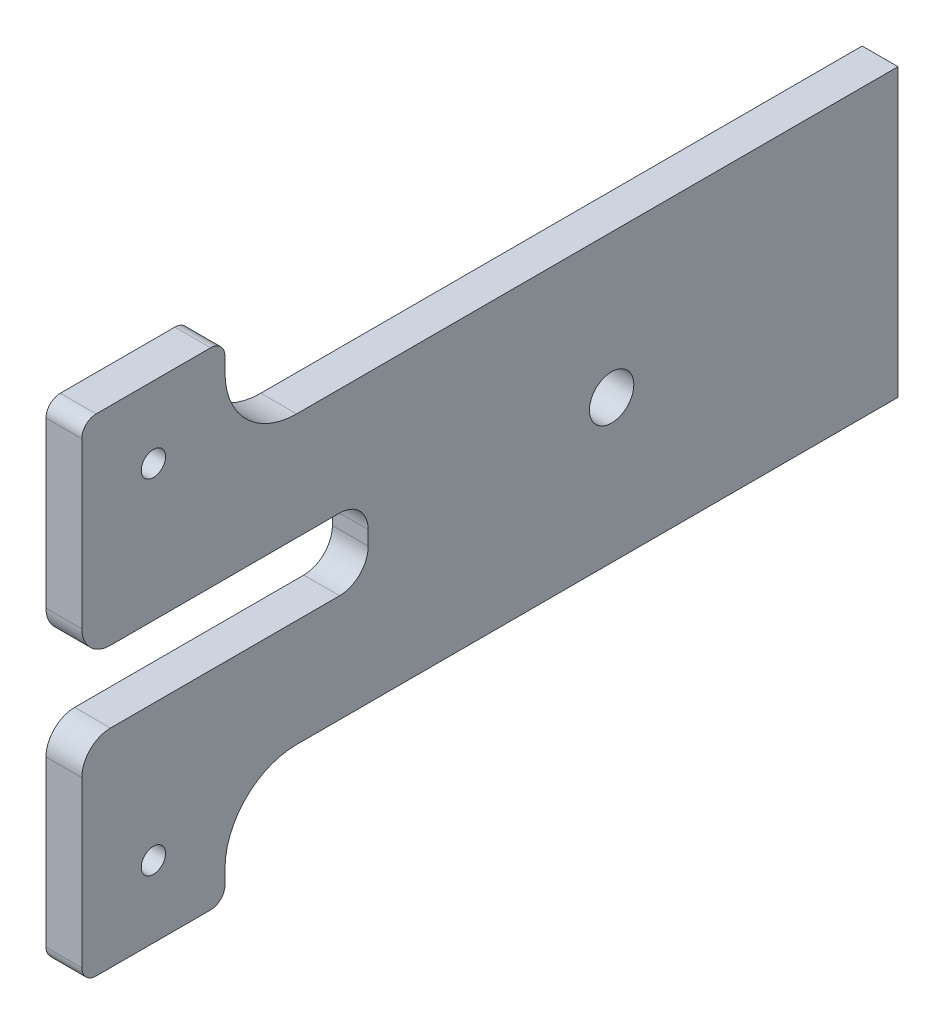
ISO-10303-21;
HEADER;
FILE_DESCRIPTION(('STEP AP214'),'2;1');
FILE_NAME('part.step','',(''),(''),'','','');
FILE_SCHEMA(('AUTOMOTIVE_DESIGN { 1 0 10303 214 1 1 1 1 }'));
ENDSEC;
DATA;
#1=APPLICATION_CONTEXT('core data for automotive mechanical design processes');
#2=APPLICATION_PROTOCOL_DEFINITION('international standard','automotive_design',2000,#1);
#3=PRODUCT_CONTEXT('',#1,'mechanical');
#4=PRODUCT('Part','Part','',(#3));
#5=PRODUCT_RELATED_PRODUCT_CATEGORY('part','',(#4));
#6=PRODUCT_DEFINITION_FORMATION('','',#4);
#7=PRODUCT_DEFINITION_CONTEXT('part definition',#1,'design');
#8=PRODUCT_DEFINITION('design','',#6,#7);
#9=PRODUCT_DEFINITION_SHAPE('','',#8);
#10=(LENGTH_UNIT() NAMED_UNIT(*) SI_UNIT(.MILLI.,.METRE.));
#11=(NAMED_UNIT(*) PLANE_ANGLE_UNIT() SI_UNIT($,.RADIAN.));
#12=(NAMED_UNIT(*) SI_UNIT($,.STERADIAN.) SOLID_ANGLE_UNIT());
#13=UNCERTAINTY_MEASURE_WITH_UNIT(LENGTH_MEASURE(1.E-05),#10,'distance_accuracy_value','');
#14=(GEOMETRIC_REPRESENTATION_CONTEXT(3) GLOBAL_UNCERTAINTY_ASSIGNED_CONTEXT((#13)) GLOBAL_UNIT_ASSIGNED_CONTEXT((#10,
#11,#12)) REPRESENTATION_CONTEXT('',''));
#15=CARTESIAN_POINT('',(0.,0.,0.));
#16=DIRECTION('',(0.,0.,1.));
#17=DIRECTION('',(1.,0.,0.));
#18=AXIS2_PLACEMENT_3D('',#15,#16,#17);
#19=CARTESIAN_POINT('',(5.,-34.,114.));
#20=DIRECTION('',(0.,0.,-1.));
#21=DIRECTION('',(0.,1.,0.));
#22=AXIS2_PLACEMENT_3D('',#19,#20,#21);
#23=PLANE('',#22);
#24=DIRECTION('',(0.,-1.,0.));
#25=VECTOR('',#24,1.);
#26=CARTESIAN_POINT('',(0.,-34.,114.));
#27=LINE('',#26,#25);
#28=CARTESIAN_POINT('',(0.,32.,114.));
#29=VERTEX_POINT('',#28);
#30=CARTESIAN_POINT('',(0.,9.,114.));
#31=VERTEX_POINT('',#30);
#32=EDGE_CURVE('E456',#29,#31,#27,.T.);
#33=ORIENTED_EDGE('',*,*,#32,.T.);
#34=DIRECTION('',(-1.,0.,0.));
#35=VECTOR('',#34,1.);
#36=CARTESIAN_POINT('',(5.,9.,114.));
#37=LINE('',#36,#35);
#38=CARTESIAN_POINT('',(5.,9.,114.));
#39=VERTEX_POINT('',#38);
#40=EDGE_CURVE('E61',#31,#39,#37,.F.);
#41=ORIENTED_EDGE('',*,*,#40,.T.);
#42=DIRECTION('',(0.,-1.,0.));
#43=VECTOR('',#42,1.);
#44=CARTESIAN_POINT('',(5.,-34.,114.));
#45=LINE('',#44,#43);
#46=CARTESIAN_POINT('',(5.,32.,114.));
#47=VERTEX_POINT('',#46);
#48=EDGE_CURVE('E430',#47,#39,#45,.T.);
#49=ORIENTED_EDGE('',*,*,#48,.F.);
#50=DIRECTION('',(-1.,0.,0.));
#51=VECTOR('',#50,1.);
#52=CARTESIAN_POINT('',(5.,32.,114.));
#53=LINE('',#52,#51);
#54=EDGE_CURVE('E266',#47,#29,#53,.T.);
#55=ORIENTED_EDGE('',*,*,#54,.T.);
#56=EDGE_LOOP('',(#33,#41,#49,#55));
#57=FACE_BOUND('',#56,.T.);
#58=ADVANCED_FACE('F45',(#57),#23,.F.);
#59=CARTESIAN_POINT('',(5.,0.,0.));
#60=DIRECTION('',(1.,0.,0.));
#61=DIRECTION('',(0.,0.,-1.));
#62=AXIS2_PLACEMENT_3D('',#59,#60,#61);
#63=PLANE('',#62);
#64=DIRECTION('',(0.,0.,1.));
#65=VECTOR('',#64,1.);
#66=CARTESIAN_POINT('',(5.,-5.,114.));
#67=LINE('',#66,#65);
#68=CARTESIAN_POINT('',(5.,-5.,78.));
#69=VERTEX_POINT('',#68);
#70=CARTESIAN_POINT('',(5.,-5.,110.));
#71=VERTEX_POINT('',#70);
#72=EDGE_CURVE('E385',#69,#71,#67,.T.);
#73=ORIENTED_EDGE('',*,*,#72,.T.);
#74=CARTESIAN_POINT('',(5.,-9.,110.));
#75=DIRECTION('',(1.,0.,0.));
#76=DIRECTION('',(0.,0.,-1.));
#77=AXIS2_PLACEMENT_3D('',#74,#75,#76);
#78=CIRCLE('',#77,4.);
#79=CARTESIAN_POINT('',(5.,-9.,114.));
#80=VERTEX_POINT('',#79);
#81=EDGE_CURVE('E336',#71,#80,#78,.T.);
#82=ORIENTED_EDGE('',*,*,#81,.T.);
#83=CARTESIAN_POINT('',(5.,-32.,114.));
#84=VERTEX_POINT('',#83);
#85=EDGE_CURVE('E429',#80,#84,#45,.T.);
#86=ORIENTED_EDGE('',*,*,#85,.T.);
#87=CARTESIAN_POINT('',(5.,-32.,112.));
#88=DIRECTION('',(1.,0.,0.));
#89=DIRECTION('',(0.,0.,-1.));
#90=AXIS2_PLACEMENT_3D('',#87,#88,#89);
#91=CIRCLE('',#90,2.);
#92=CARTESIAN_POINT('',(5.,-34.,112.));
#93=VERTEX_POINT('',#92);
#94=EDGE_CURVE('E293',#84,#93,#91,.T.);
#95=ORIENTED_EDGE('',*,*,#94,.T.);
#96=DIRECTION('',(0.,0.,-1.));
#97=VECTOR('',#96,1.);
#98=CARTESIAN_POINT('',(5.,-34.,114.));
#99=LINE('',#98,#97);
#100=CARTESIAN_POINT('',(5.,-34.,96.));
#101=VERTEX_POINT('',#100);
#102=EDGE_CURVE('E433',#93,#101,#99,.T.);
#103=ORIENTED_EDGE('',*,*,#102,.T.);
#104=CARTESIAN_POINT('',(5.,-32.,96.));
#105=DIRECTION('',(1.,0.,0.));
#106=DIRECTION('',(0.,0.,-1.));
#107=AXIS2_PLACEMENT_3D('',#104,#105,#106);
#108=CIRCLE('',#107,2.);
#109=CARTESIAN_POINT('',(5.,-32.,94.));
#110=VERTEX_POINT('',#109);
#111=EDGE_CURVE('E290',#101,#110,#108,.T.);
#112=ORIENTED_EDGE('',*,*,#111,.T.);
#113=DIRECTION('',(0.,1.,0.));
#114=VECTOR('',#113,1.);
#115=CARTESIAN_POINT('',(5.,-34.,94.));
#116=LINE('',#115,#114);
#117=CARTESIAN_POINT('',(5.,-30.,94.));
#118=VERTEX_POINT('',#117);
#119=EDGE_CURVE('E437',#110,#118,#116,.T.);
#120=ORIENTED_EDGE('',*,*,#119,.T.);
#121=CARTESIAN_POINT('',(5.,-30.,84.));
#122=DIRECTION('',(1.,0.,0.));
#123=DIRECTION('',(0.,0.,-1.));
#124=AXIS2_PLACEMENT_3D('',#121,#122,#123);
#125=CIRCLE('',#124,10.);
#126=CARTESIAN_POINT('',(5.,-20.,84.));
#127=VERTEX_POINT('',#126);
#128=EDGE_CURVE('E253',#118,#127,#125,.F.);
#129=ORIENTED_EDGE('',*,*,#128,.T.);
#130=DIRECTION('',(0.,0.,-1.));
#131=VECTOR('',#130,1.);
#132=CARTESIAN_POINT('',(5.,-20.,0.));
#133=LINE('',#132,#131);
#134=CARTESIAN_POINT('',(5.,-20.,0.));
#135=VERTEX_POINT('',#134);
#136=EDGE_CURVE('E218',#127,#135,#133,.T.);
#137=ORIENTED_EDGE('',*,*,#136,.T.);
#138=DIRECTION('',(0.,1.,0.));
#139=VECTOR('',#138,1.);
#140=CARTESIAN_POINT('',(5.,-20.,0.));
#141=LINE('',#140,#139);
#142=CARTESIAN_POINT('',(5.,20.,0.));
#143=VERTEX_POINT('',#142);
#144=EDGE_CURVE('E211',#135,#143,#141,.T.);
#145=ORIENTED_EDGE('',*,*,#144,.T.);
#146=DIRECTION('',(0.,0.,1.));
#147=VECTOR('',#146,1.);
#148=CARTESIAN_POINT('',(5.,20.,0.));
#149=LINE('',#148,#147);
#150=CARTESIAN_POINT('',(5.,20.,84.));
#151=VERTEX_POINT('',#150);
#152=EDGE_CURVE('E198',#143,#151,#149,.T.);
#153=ORIENTED_EDGE('',*,*,#152,.T.);
#154=CARTESIAN_POINT('',(5.,30.,84.));
#155=DIRECTION('',(1.,0.,0.));
#156=DIRECTION('',(0.,0.,-1.));
#157=AXIS2_PLACEMENT_3D('',#154,#155,#156);
#158=CIRCLE('',#157,10.);
#159=CARTESIAN_POINT('',(5.,30.,94.));
#160=VERTEX_POINT('',#159);
#161=EDGE_CURVE('E259',#151,#160,#158,.F.);
#162=ORIENTED_EDGE('',*,*,#161,.T.);
#163=DIRECTION('',(0.,1.,0.));
#164=VECTOR('',#163,1.);
#165=CARTESIAN_POINT('',(5.,20.,94.));
#166=LINE('',#165,#164);
#167=CARTESIAN_POINT('',(5.,32.,94.));
#168=VERTEX_POINT('',#167);
#169=EDGE_CURVE('E210',#160,#168,#166,.T.);
#170=ORIENTED_EDGE('',*,*,#169,.T.);
#171=CARTESIAN_POINT('',(5.,32.,96.));
#172=DIRECTION('',(1.,0.,0.));
#173=DIRECTION('',(0.,0.,-1.));
#174=AXIS2_PLACEMENT_3D('',#171,#172,#173);
#175=CIRCLE('',#174,2.);
#176=CARTESIAN_POINT('',(5.,34.,96.));
#177=VERTEX_POINT('',#176);
#178=EDGE_CURVE('E296',#168,#177,#175,.T.);
#179=ORIENTED_EDGE('',*,*,#178,.T.);
#180=DIRECTION('',(0.,0.,1.));
#181=VECTOR('',#180,1.);
#182=CARTESIAN_POINT('',(5.,34.,94.));
#183=LINE('',#182,#181);
#184=CARTESIAN_POINT('',(5.,34.,112.));
#185=VERTEX_POINT('',#184);
#186=EDGE_CURVE('E425',#177,#185,#183,.T.);
#187=ORIENTED_EDGE('',*,*,#186,.T.);
#188=CARTESIAN_POINT('',(5.,32.,112.));
#189=DIRECTION('',(1.,0.,0.));
#190=DIRECTION('',(0.,0.,-1.));
#191=AXIS2_PLACEMENT_3D('',#188,#189,#190);
#192=CIRCLE('',#191,2.);
#193=EDGE_CURVE('E299',#185,#47,#192,.T.);
#194=ORIENTED_EDGE('',*,*,#193,.T.);
#195=ORIENTED_EDGE('',*,*,#48,.T.);
#196=CARTESIAN_POINT('',(5.,9.,110.));
#197=DIRECTION('',(1.,0.,0.));
#198=DIRECTION('',(0.,0.,-1.));
#199=AXIS2_PLACEMENT_3D('',#196,#197,#198);
#200=CIRCLE('',#199,4.);
#201=CARTESIAN_POINT('',(5.,5.,110.));
#202=VERTEX_POINT('',#201);
#203=EDGE_CURVE('E333',#39,#202,#200,.T.);
#204=ORIENTED_EDGE('',*,*,#203,.T.);
#205=DIRECTION('',(0.,0.,-1.));
#206=VECTOR('',#205,1.);
#207=CARTESIAN_POINT('',(5.,5.,114.));
#208=LINE('',#207,#206);
#209=CARTESIAN_POINT('',(5.,4.99999999999999,78.));
#210=VERTEX_POINT('',#209);
#211=EDGE_CURVE('E382',#202,#210,#208,.T.);
#212=ORIENTED_EDGE('',*,*,#211,.T.);
#213=CARTESIAN_POINT('',(5.,0.999999999999988,78.));
#214=DIRECTION('',(1.,0.,0.));
#215=DIRECTION('',(0.,0.,-1.));
#216=AXIS2_PLACEMENT_3D('',#213,#214,#215);
#217=CIRCLE('',#216,4.);
#218=CARTESIAN_POINT('',(5.,0.999999999999988,74.));
#219=VERTEX_POINT('',#218);
#220=EDGE_CURVE('E11',#210,#219,#217,.F.);
#221=ORIENTED_EDGE('',*,*,#220,.T.);
#222=DIRECTION('',(0.,-1.,0.));
#223=VECTOR('',#222,1.);
#224=CARTESIAN_POINT('',(5.,4.99999999999999,74.));
#225=LINE('',#224,#223);
#226=CARTESIAN_POINT('',(5.,-1.00000000000001,74.));
#227=VERTEX_POINT('',#226);
#228=EDGE_CURVE('E380',#219,#227,#225,.T.);
#229=ORIENTED_EDGE('',*,*,#228,.T.);
#230=CARTESIAN_POINT('',(5.,-1.,78.));
#231=DIRECTION('',(1.,0.,0.));
#232=DIRECTION('',(0.,0.,-1.));
#233=AXIS2_PLACEMENT_3D('',#230,#231,#232);
#234=CIRCLE('',#233,4.);
#235=EDGE_CURVE('E357',#227,#69,#234,.F.);
#236=ORIENTED_EDGE('',*,*,#235,.T.);
#237=EDGE_LOOP('',(#73,#82,#86,#95,#103,#112,#120,#129,#137,#145,#153,#162,#170,#179,#187,#194,
#195,#204,#212,#221,#229,#236));
#238=FACE_BOUND('',#237,.T.);
#239=CARTESIAN_POINT('',(5.,-24.,104.));
#240=DIRECTION('',(1.,0.,0.));
#241=DIRECTION('',(0.,0.,-1.));
#242=AXIS2_PLACEMENT_3D('',#239,#240,#241);
#243=CIRCLE('',#242,1.7);
#244=CARTESIAN_POINT('',(5.,-24.,102.3));
#245=VERTEX_POINT('',#244);
#246=EDGE_CURVE('E407',#245,#245,#243,.T.);
#247=ORIENTED_EDGE('',*,*,#246,.F.);
#248=EDGE_LOOP('',(#247));
#249=FACE_BOUND('',#248,.T.);
#250=CARTESIAN_POINT('',(5.,0.,40.));
#251=DIRECTION('',(1.,0.,0.));
#252=DIRECTION('',(0.,0.,-1.));
#253=AXIS2_PLACEMENT_3D('',#250,#251,#252);
#254=CIRCLE('',#253,3.1);
#255=CARTESIAN_POINT('',(5.,0.,36.9));
#256=VERTEX_POINT('',#255);
#257=EDGE_CURVE('E415',#256,#256,#254,.T.);
#258=ORIENTED_EDGE('',*,*,#257,.F.);
#259=EDGE_LOOP('',(#258));
#260=FACE_BOUND('',#259,.T.);
#261=CARTESIAN_POINT('',(5.,24.,104.));
#262=DIRECTION('',(1.,0.,0.));
#263=DIRECTION('',(0.,0.,-1.));
#264=AXIS2_PLACEMENT_3D('',#261,#262,#263);
#265=CIRCLE('',#264,1.7);
#266=CARTESIAN_POINT('',(5.,24.,102.3));
#267=VERTEX_POINT('',#266);
#268=EDGE_CURVE('E399',#267,#267,#265,.T.);
#269=ORIENTED_EDGE('',*,*,#268,.F.);
#270=EDGE_LOOP('',(#269));
#271=FACE_BOUND('',#270,.T.);
#272=ADVANCED_FACE('F215',(#238,#249,#260,#271),#63,.T.);
#273=CARTESIAN_POINT('',(0.,0.,0.));
#274=DIRECTION('',(1.,0.,0.));
#275=DIRECTION('',(0.,0.,-1.));
#276=AXIS2_PLACEMENT_3D('',#273,#274,#275);
#277=PLANE('',#276);
#278=CARTESIAN_POINT('',(0.,-9.,114.));
#279=VERTEX_POINT('',#278);
#280=CARTESIAN_POINT('',(0.,-32.,114.));
#281=VERTEX_POINT('',#280);
#282=EDGE_CURVE('E455',#279,#281,#27,.T.);
#283=ORIENTED_EDGE('',*,*,#282,.F.);
#284=CARTESIAN_POINT('',(0.,-9.,110.));
#285=DIRECTION('',(1.,0.,0.));
#286=DIRECTION('',(0.,0.,-1.));
#287=AXIS2_PLACEMENT_3D('',#284,#285,#286);
#288=CIRCLE('',#287,4.);
#289=CARTESIAN_POINT('',(0.,-5.,110.));
#290=VERTEX_POINT('',#289);
#291=EDGE_CURVE('E323',#279,#290,#288,.F.);
#292=ORIENTED_EDGE('',*,*,#291,.T.);
#293=DIRECTION('',(0.,0.,1.));
#294=VECTOR('',#293,1.);
#295=CARTESIAN_POINT('',(0.,-5.,114.));
#296=LINE('',#295,#294);
#297=CARTESIAN_POINT('',(0.,-5.,78.));
#298=VERTEX_POINT('',#297);
#299=EDGE_CURVE('E391',#298,#290,#296,.T.);
#300=ORIENTED_EDGE('',*,*,#299,.F.);
#301=CARTESIAN_POINT('',(0.,-1.,78.));
#302=DIRECTION('',(1.,0.,0.));
#303=DIRECTION('',(0.,0.,-1.));
#304=AXIS2_PLACEMENT_3D('',#301,#302,#303);
#305=CIRCLE('',#304,4.);
#306=CARTESIAN_POINT('',(0.,-1.00000000000001,74.));
#307=VERTEX_POINT('',#306);
#308=EDGE_CURVE('E354',#298,#307,#305,.T.);
#309=ORIENTED_EDGE('',*,*,#308,.T.);
#310=DIRECTION('',(0.,-1.,0.));
#311=VECTOR('',#310,1.);
#312=CARTESIAN_POINT('',(0.,4.99999999999999,74.));
#313=LINE('',#312,#311);
#314=CARTESIAN_POINT('',(0.,0.999999999999988,74.));
#315=VERTEX_POINT('',#314);
#316=EDGE_CURVE('E368',#315,#307,#313,.T.);
#317=ORIENTED_EDGE('',*,*,#316,.F.);
#318=CARTESIAN_POINT('',(0.,0.999999999999988,78.));
#319=DIRECTION('',(1.,0.,0.));
#320=DIRECTION('',(0.,0.,-1.));
#321=AXIS2_PLACEMENT_3D('',#318,#319,#320);
#322=CIRCLE('',#321,4.);
#323=CARTESIAN_POINT('',(0.,4.99999999999999,78.));
#324=VERTEX_POINT('',#323);
#325=EDGE_CURVE('E54',#315,#324,#322,.T.);
#326=ORIENTED_EDGE('',*,*,#325,.T.);
#327=DIRECTION('',(0.,0.,-1.));
#328=VECTOR('',#327,1.);
#329=CARTESIAN_POINT('',(0.,5.,114.));
#330=LINE('',#329,#328);
#331=CARTESIAN_POINT('',(0.,5.,110.));
#332=VERTEX_POINT('',#331);
#333=EDGE_CURVE('E367',#332,#324,#330,.T.);
#334=ORIENTED_EDGE('',*,*,#333,.F.);
#335=CARTESIAN_POINT('',(0.,9.,110.));
#336=DIRECTION('',(1.,0.,0.));
#337=DIRECTION('',(0.,0.,-1.));
#338=AXIS2_PLACEMENT_3D('',#335,#336,#337);
#339=CIRCLE('',#338,4.);
#340=EDGE_CURVE('E320',#332,#31,#339,.F.);
#341=ORIENTED_EDGE('',*,*,#340,.T.);
#342=ORIENTED_EDGE('',*,*,#32,.F.);
#343=CARTESIAN_POINT('',(0.,32.,112.));
#344=DIRECTION('',(1.,0.,0.));
#345=DIRECTION('',(0.,0.,-1.));
#346=AXIS2_PLACEMENT_3D('',#343,#344,#345);
#347=CIRCLE('',#346,2.);
#348=CARTESIAN_POINT('',(0.,34.,112.));
#349=VERTEX_POINT('',#348);
#350=EDGE_CURVE('E280',#29,#349,#347,.F.);
#351=ORIENTED_EDGE('',*,*,#350,.T.);
#352=DIRECTION('',(0.,0.,1.));
#353=VECTOR('',#352,1.);
#354=CARTESIAN_POINT('',(0.,34.,94.));
#355=LINE('',#354,#353);
#356=CARTESIAN_POINT('',(0.,34.,96.));
#357=VERTEX_POINT('',#356);
#358=EDGE_CURVE('E451',#357,#349,#355,.T.);
#359=ORIENTED_EDGE('',*,*,#358,.F.);
#360=CARTESIAN_POINT('',(0.,32.,96.));
#361=DIRECTION('',(1.,0.,0.));
#362=DIRECTION('',(0.,0.,-1.));
#363=AXIS2_PLACEMENT_3D('',#360,#361,#362);
#364=CIRCLE('',#363,2.);
#365=CARTESIAN_POINT('',(0.,32.,94.));
#366=VERTEX_POINT('',#365);
#367=EDGE_CURVE('E277',#357,#366,#364,.F.);
#368=ORIENTED_EDGE('',*,*,#367,.T.);
#369=DIRECTION('',(0.,1.,0.));
#370=VECTOR('',#369,1.);
#371=CARTESIAN_POINT('',(0.,20.,94.));
#372=LINE('',#371,#370);
#373=CARTESIAN_POINT('',(0.,30.,94.));
#374=VERTEX_POINT('',#373);
#375=EDGE_CURVE('E447',#374,#366,#372,.T.);
#376=ORIENTED_EDGE('',*,*,#375,.F.);
#377=CARTESIAN_POINT('',(0.,30.,84.));
#378=DIRECTION('',(1.,0.,0.));
#379=DIRECTION('',(0.,0.,-1.));
#380=AXIS2_PLACEMENT_3D('',#377,#378,#379);
#381=CIRCLE('',#380,10.);
#382=CARTESIAN_POINT('',(0.,20.,84.));
#383=VERTEX_POINT('',#382);
#384=EDGE_CURVE('E256',#374,#383,#381,.T.);
#385=ORIENTED_EDGE('',*,*,#384,.T.);
#386=DIRECTION('',(0.,0.,1.));
#387=VECTOR('',#386,1.);
#388=CARTESIAN_POINT('',(0.,20.,0.));
#389=LINE('',#388,#387);
#390=CARTESIAN_POINT('',(0.,20.,0.));
#391=VERTEX_POINT('',#390);
#392=EDGE_CURVE('E444',#391,#383,#389,.T.);
#393=ORIENTED_EDGE('',*,*,#392,.F.);
#394=DIRECTION('',(0.,1.,0.));
#395=VECTOR('',#394,1.);
#396=CARTESIAN_POINT('',(0.,-20.,0.));
#397=LINE('',#396,#395);
#398=CARTESIAN_POINT('',(0.,-20.,0.));
#399=VERTEX_POINT('',#398);
#400=EDGE_CURVE('E227',#399,#391,#397,.T.);
#401=ORIENTED_EDGE('',*,*,#400,.F.);
#402=DIRECTION('',(0.,0.,-1.));
#403=VECTOR('',#402,1.);
#404=CARTESIAN_POINT('',(0.,-20.,0.));
#405=LINE('',#404,#403);
#406=CARTESIAN_POINT('',(0.,-20.,84.));
#407=VERTEX_POINT('',#406);
#408=EDGE_CURVE('E223',#407,#399,#405,.T.);
#409=ORIENTED_EDGE('',*,*,#408,.F.);
#410=CARTESIAN_POINT('',(0.,-30.,84.));
#411=DIRECTION('',(1.,0.,0.));
#412=DIRECTION('',(0.,0.,-1.));
#413=AXIS2_PLACEMENT_3D('',#410,#411,#412);
#414=CIRCLE('',#413,10.);
#415=CARTESIAN_POINT('',(0.,-30.,94.));
#416=VERTEX_POINT('',#415);
#417=EDGE_CURVE('E249',#407,#416,#414,.T.);
#418=ORIENTED_EDGE('',*,*,#417,.T.);
#419=DIRECTION('',(0.,1.,0.));
#420=VECTOR('',#419,1.);
#421=CARTESIAN_POINT('',(0.,-34.,94.));
#422=LINE('',#421,#420);
#423=CARTESIAN_POINT('',(0.,-32.,94.));
#424=VERTEX_POINT('',#423);
#425=EDGE_CURVE('E463',#424,#416,#422,.T.);
#426=ORIENTED_EDGE('',*,*,#425,.F.);
#427=CARTESIAN_POINT('',(0.,-32.,96.));
#428=DIRECTION('',(1.,0.,0.));
#429=DIRECTION('',(0.,0.,-1.));
#430=AXIS2_PLACEMENT_3D('',#427,#428,#429);
#431=CIRCLE('',#430,2.);
#432=CARTESIAN_POINT('',(0.,-34.,96.));
#433=VERTEX_POINT('',#432);
#434=EDGE_CURVE('E270',#424,#433,#431,.F.);
#435=ORIENTED_EDGE('',*,*,#434,.T.);
#436=DIRECTION('',(0.,0.,-1.));
#437=VECTOR('',#436,1.);
#438=CARTESIAN_POINT('',(0.,-34.,114.));
#439=LINE('',#438,#437);
#440=CARTESIAN_POINT('',(0.,-34.,112.));
#441=VERTEX_POINT('',#440);
#442=EDGE_CURVE('E459',#441,#433,#439,.T.);
#443=ORIENTED_EDGE('',*,*,#442,.F.);
#444=CARTESIAN_POINT('',(0.,-32.,112.));
#445=DIRECTION('',(1.,0.,0.));
#446=DIRECTION('',(0.,0.,-1.));
#447=AXIS2_PLACEMENT_3D('',#444,#445,#446);
#448=CIRCLE('',#447,2.);
#449=EDGE_CURVE('E273',#441,#281,#448,.F.);
#450=ORIENTED_EDGE('',*,*,#449,.T.);
#451=EDGE_LOOP('',(#283,#292,#300,#309,#317,#326,#334,#341,#342,#351,#359,#368,#376,#385,#393,
#401,#409,#418,#426,#435,#443,#450));
#452=FACE_BOUND('',#451,.T.);
#453=CARTESIAN_POINT('',(0.,0.,40.));
#454=DIRECTION('',(1.,0.,0.));
#455=DIRECTION('',(0.,0.,-1.));
#456=AXIS2_PLACEMENT_3D('',#453,#454,#455);
#457=CIRCLE('',#456,3.1);
#458=CARTESIAN_POINT('',(0.,0.,36.9));
#459=VERTEX_POINT('',#458);
#460=EDGE_CURVE('E411',#459,#459,#457,.T.);
#461=ORIENTED_EDGE('',*,*,#460,.T.);
#462=EDGE_LOOP('',(#461));
#463=FACE_BOUND('',#462,.T.);
#464=CARTESIAN_POINT('',(0.,-24.,104.));
#465=DIRECTION('',(1.,0.,0.));
#466=DIRECTION('',(0.,0.,-1.));
#467=AXIS2_PLACEMENT_3D('',#464,#465,#466);
#468=CIRCLE('',#467,1.7);
#469=CARTESIAN_POINT('',(0.,-24.,102.3));
#470=VERTEX_POINT('',#469);
#471=EDGE_CURVE('E403',#470,#470,#468,.T.);
#472=ORIENTED_EDGE('',*,*,#471,.T.);
#473=EDGE_LOOP('',(#472));
#474=FACE_BOUND('',#473,.T.);
#475=CARTESIAN_POINT('',(0.,24.,104.));
#476=DIRECTION('',(1.,0.,0.));
#477=DIRECTION('',(0.,0.,-1.));
#478=AXIS2_PLACEMENT_3D('',#475,#476,#477);
#479=CIRCLE('',#478,1.7);
#480=CARTESIAN_POINT('',(0.,24.,102.3));
#481=VERTEX_POINT('',#480);
#482=EDGE_CURVE('E389',#481,#481,#479,.T.);
#483=ORIENTED_EDGE('',*,*,#482,.T.);
#484=EDGE_LOOP('',(#483));
#485=FACE_BOUND('',#484,.T.);
#486=ADVANCED_FACE('F365',(#452,#463,#474,#485),#277,.F.);
#487=CARTESIAN_POINT('',(5.,-20.,0.));
#488=DIRECTION('',(0.,0.,1.));
#489=DIRECTION('',(0.,-1.,0.));
#490=AXIS2_PLACEMENT_3D('',#487,#488,#489);
#491=PLANE('',#490);
#492=ORIENTED_EDGE('',*,*,#400,.T.);
#493=DIRECTION('',(-1.,0.,0.));
#494=VECTOR('',#493,1.);
#495=CARTESIAN_POINT('',(5.,20.,0.));
#496=LINE('',#495,#494);
#497=EDGE_CURVE('E203',#143,#391,#496,.T.);
#498=ORIENTED_EDGE('',*,*,#497,.F.);
#499=ORIENTED_EDGE('',*,*,#144,.F.);
#500=DIRECTION('',(-1.,0.,0.));
#501=VECTOR('',#500,1.);
#502=CARTESIAN_POINT('',(5.,-20.,0.));
#503=LINE('',#502,#501);
#504=EDGE_CURVE('E230',#135,#399,#503,.T.);
#505=ORIENTED_EDGE('',*,*,#504,.T.);
#506=EDGE_LOOP('',(#492,#498,#499,#505));
#507=FACE_BOUND('',#506,.T.);
#508=ADVANCED_FACE('F225',(#507),#491,.F.);
#509=CARTESIAN_POINT('',(5.,20.,0.));
#510=DIRECTION('',(0.,-1.,0.));
#511=DIRECTION('',(0.,0.,-1.));
#512=AXIS2_PLACEMENT_3D('',#509,#510,#511);
#513=PLANE('',#512);
#514=ORIENTED_EDGE('',*,*,#392,.T.);
#515=DIRECTION('',(-1.,0.,0.));
#516=VECTOR('',#515,1.);
#517=CARTESIAN_POINT('',(5.,20.,84.));
#518=LINE('',#517,#516);
#519=EDGE_CURVE('E206',#383,#151,#518,.F.);
#520=ORIENTED_EDGE('',*,*,#519,.T.);
#521=ORIENTED_EDGE('',*,*,#152,.F.);
#522=ORIENTED_EDGE('',*,*,#497,.T.);
#523=EDGE_LOOP('',(#514,#520,#521,#522));
#524=FACE_BOUND('',#523,.T.);
#525=ADVANCED_FACE('F201',(#524),#513,.F.);
#526=CARTESIAN_POINT('',(5.,20.,94.));
#527=DIRECTION('',(0.,0.,1.));
#528=DIRECTION('',(0.,-1.,0.));
#529=AXIS2_PLACEMENT_3D('',#526,#527,#528);
#530=PLANE('',#529);
#531=ORIENTED_EDGE('',*,*,#375,.T.);
#532=DIRECTION('',(-1.,0.,0.));
#533=VECTOR('',#532,1.);
#534=CARTESIAN_POINT('',(5.,32.,94.));
#535=LINE('',#534,#533);
#536=EDGE_CURVE('E302',#366,#168,#535,.F.);
#537=ORIENTED_EDGE('',*,*,#536,.T.);
#538=ORIENTED_EDGE('',*,*,#169,.F.);
#539=DIRECTION('',(-1.,0.,0.));
#540=VECTOR('',#539,1.);
#541=CARTESIAN_POINT('',(0.,30.,94.));
#542=LINE('',#541,#540);
#543=EDGE_CURVE('E243',#160,#374,#542,.T.);
#544=ORIENTED_EDGE('',*,*,#543,.T.);
#545=EDGE_LOOP('',(#531,#537,#538,#544));
#546=FACE_BOUND('',#545,.T.);
#547=ADVANCED_FACE('F477',(#546),#530,.F.);
#548=CARTESIAN_POINT('',(5.,34.,94.));
#549=DIRECTION('',(0.,-1.,0.));
#550=DIRECTION('',(0.,0.,-1.));
#551=AXIS2_PLACEMENT_3D('',#548,#549,#550);
#552=PLANE('',#551);
#553=ORIENTED_EDGE('',*,*,#358,.T.);
#554=DIRECTION('',(-1.,0.,0.));
#555=VECTOR('',#554,1.);
#556=CARTESIAN_POINT('',(5.,34.,112.));
#557=LINE('',#556,#555);
#558=EDGE_CURVE('E287',#349,#185,#557,.F.);
#559=ORIENTED_EDGE('',*,*,#558,.T.);
#560=ORIENTED_EDGE('',*,*,#186,.F.);
#561=DIRECTION('',(-1.,0.,0.));
#562=VECTOR('',#561,1.);
#563=CARTESIAN_POINT('',(5.,34.,96.));
#564=LINE('',#563,#562);
#565=EDGE_CURVE('E283',#177,#357,#564,.T.);
#566=ORIENTED_EDGE('',*,*,#565,.T.);
#567=EDGE_LOOP('',(#553,#559,#560,#566));
#568=FACE_BOUND('',#567,.T.);
#569=ADVANCED_FACE('F485',(#568),#552,.F.);
#570=ORIENTED_EDGE('',*,*,#85,.F.);
#571=DIRECTION('',(-1.,0.,0.));
#572=VECTOR('',#571,1.);
#573=CARTESIAN_POINT('',(5.,-9.,114.));
#574=LINE('',#573,#572);
#575=EDGE_CURVE('E316',#80,#279,#574,.T.);
#576=ORIENTED_EDGE('',*,*,#575,.T.);
#577=ORIENTED_EDGE('',*,*,#282,.T.);
#578=DIRECTION('',(-1.,0.,0.));
#579=VECTOR('',#578,1.);
#580=CARTESIAN_POINT('',(5.,-32.,114.));
#581=LINE('',#580,#579);
#582=EDGE_CURVE('E262',#281,#84,#581,.F.);
#583=ORIENTED_EDGE('',*,*,#582,.T.);
#584=EDGE_LOOP('',(#570,#576,#577,#583));
#585=FACE_BOUND('',#584,.T.);
#586=ADVANCED_FACE('F508',(#585),#23,.F.);
#587=CARTESIAN_POINT('',(5.,-34.,114.));
#588=DIRECTION('',(0.,1.,0.));
#589=DIRECTION('',(0.,0.,1.));
#590=AXIS2_PLACEMENT_3D('',#587,#588,#589);
#591=PLANE('',#590);
#592=ORIENTED_EDGE('',*,*,#102,.F.);
#593=DIRECTION('',(-1.,0.,0.));
#594=VECTOR('',#593,1.);
#595=CARTESIAN_POINT('',(5.,-34.,112.));
#596=LINE('',#595,#594);
#597=EDGE_CURVE('E308',#93,#441,#596,.T.);
#598=ORIENTED_EDGE('',*,*,#597,.T.);
#599=ORIENTED_EDGE('',*,*,#442,.T.);
#600=DIRECTION('',(-1.,0.,0.));
#601=VECTOR('',#600,1.);
#602=CARTESIAN_POINT('',(5.,-34.,96.));
#603=LINE('',#602,#601);
#604=EDGE_CURVE('E305',#433,#101,#603,.F.);
#605=ORIENTED_EDGE('',*,*,#604,.T.);
#606=EDGE_LOOP('',(#592,#598,#599,#605));
#607=FACE_BOUND('',#606,.T.);
#608=ADVANCED_FACE('F517',(#607),#591,.F.);
#609=CARTESIAN_POINT('',(5.,-34.,94.));
#610=DIRECTION('',(0.,0.,1.));
#611=DIRECTION('',(0.,-1.,0.));
#612=AXIS2_PLACEMENT_3D('',#609,#610,#611);
#613=PLANE('',#612);
#614=ORIENTED_EDGE('',*,*,#119,.F.);
#615=DIRECTION('',(-1.,0.,0.));
#616=VECTOR('',#615,1.);
#617=CARTESIAN_POINT('',(5.,-32.,94.));
#618=LINE('',#617,#616);
#619=EDGE_CURVE('E312',#110,#424,#618,.T.);
#620=ORIENTED_EDGE('',*,*,#619,.T.);
#621=ORIENTED_EDGE('',*,*,#425,.T.);
#622=DIRECTION('',(-1.,0.,0.));
#623=VECTOR('',#622,1.);
#624=CARTESIAN_POINT('',(5.,-30.,94.));
#625=LINE('',#624,#623);
#626=EDGE_CURVE('E235',#416,#118,#625,.F.);
#627=ORIENTED_EDGE('',*,*,#626,.T.);
#628=EDGE_LOOP('',(#614,#620,#621,#627));
#629=FACE_BOUND('',#628,.T.);
#630=ADVANCED_FACE('F524',(#629),#613,.F.);
#631=CARTESIAN_POINT('',(5.,-20.,0.));
#632=DIRECTION('',(0.,1.,0.));
#633=DIRECTION('',(0.,0.,1.));
#634=AXIS2_PLACEMENT_3D('',#631,#632,#633);
#635=PLANE('',#634);
#636=ORIENTED_EDGE('',*,*,#136,.F.);
#637=DIRECTION('',(-1.,0.,0.));
#638=VECTOR('',#637,1.);
#639=CARTESIAN_POINT('',(0.,-20.,84.));
#640=LINE('',#639,#638);
#641=EDGE_CURVE('E229',#127,#407,#640,.T.);
#642=ORIENTED_EDGE('',*,*,#641,.T.);
#643=ORIENTED_EDGE('',*,*,#408,.T.);
#644=ORIENTED_EDGE('',*,*,#504,.F.);
#645=EDGE_LOOP('',(#636,#642,#643,#644));
#646=FACE_BOUND('',#645,.T.);
#647=ADVANCED_FACE('F468',(#646),#635,.F.);
#648=CARTESIAN_POINT('',(5.,0.,40.));
#649=DIRECTION('',(-1.,0.,0.));
#650=DIRECTION('',(0.,0.,1.));
#651=AXIS2_PLACEMENT_3D('',#648,#649,#650);
#652=CYLINDRICAL_SURFACE('',#651,3.1);
#653=ORIENTED_EDGE('',*,*,#257,.T.);
#654=EDGE_LOOP('',(#653));
#655=FACE_BOUND('',#654,.T.);
#656=ORIENTED_EDGE('',*,*,#460,.F.);
#657=EDGE_LOOP('',(#656));
#658=FACE_BOUND('',#657,.T.);
#659=ADVANCED_FACE('F556',(#655,#658),#652,.F.);
#660=CARTESIAN_POINT('',(5.,-24.,104.));
#661=DIRECTION('',(-1.,0.,0.));
#662=DIRECTION('',(0.,0.,1.));
#663=AXIS2_PLACEMENT_3D('',#660,#661,#662);
#664=CYLINDRICAL_SURFACE('',#663,1.7);
#665=ORIENTED_EDGE('',*,*,#246,.T.);
#666=EDGE_LOOP('',(#665));
#667=FACE_BOUND('',#666,.T.);
#668=ORIENTED_EDGE('',*,*,#471,.F.);
#669=EDGE_LOOP('',(#668));
#670=FACE_BOUND('',#669,.T.);
#671=ADVANCED_FACE('F552',(#667,#670),#664,.F.);
#672=CARTESIAN_POINT('',(5.,24.,104.));
#673=DIRECTION('',(-1.,0.,0.));
#674=DIRECTION('',(0.,0.,1.));
#675=AXIS2_PLACEMENT_3D('',#672,#673,#674);
#676=CYLINDRICAL_SURFACE('',#675,1.7);
#677=ORIENTED_EDGE('',*,*,#268,.T.);
#678=EDGE_LOOP('',(#677));
#679=FACE_BOUND('',#678,.T.);
#680=ORIENTED_EDGE('',*,*,#482,.F.);
#681=EDGE_LOOP('',(#680));
#682=FACE_BOUND('',#681,.T.);
#683=ADVANCED_FACE('F548',(#679,#682),#676,.F.);
#684=CARTESIAN_POINT('',(5.,-30.,84.));
#685=DIRECTION('',(1.,0.,0.));
#686=DIRECTION('',(0.,0.,-1.));
#687=AXIS2_PLACEMENT_3D('',#684,#685,#686);
#688=CYLINDRICAL_SURFACE('',#687,10.);
#689=ORIENTED_EDGE('',*,*,#128,.F.);
#690=ORIENTED_EDGE('',*,*,#626,.F.);
#691=ORIENTED_EDGE('',*,*,#417,.F.);
#692=ORIENTED_EDGE('',*,*,#641,.F.);
#693=EDGE_LOOP('',(#689,#690,#691,#692));
#694=FACE_BOUND('',#693,.T.);
#695=ADVANCED_FACE('F551',(#694),#688,.F.);
#696=CARTESIAN_POINT('',(5.,30.,84.));
#697=DIRECTION('',(1.,0.,0.));
#698=DIRECTION('',(0.,0.,-1.));
#699=AXIS2_PLACEMENT_3D('',#696,#697,#698);
#700=CYLINDRICAL_SURFACE('',#699,10.);
#701=ORIENTED_EDGE('',*,*,#161,.F.);
#702=ORIENTED_EDGE('',*,*,#519,.F.);
#703=ORIENTED_EDGE('',*,*,#384,.F.);
#704=ORIENTED_EDGE('',*,*,#543,.F.);
#705=EDGE_LOOP('',(#701,#702,#703,#704));
#706=FACE_BOUND('',#705,.T.);
#707=ADVANCED_FACE('F472',(#706),#700,.F.);
#708=CARTESIAN_POINT('',(5.,32.,112.));
#709=DIRECTION('',(-1.,0.,0.));
#710=DIRECTION('',(0.,0.,1.));
#711=AXIS2_PLACEMENT_3D('',#708,#709,#710);
#712=CYLINDRICAL_SURFACE('',#711,2.);
#713=ORIENTED_EDGE('',*,*,#193,.F.);
#714=ORIENTED_EDGE('',*,*,#558,.F.);
#715=ORIENTED_EDGE('',*,*,#350,.F.);
#716=ORIENTED_EDGE('',*,*,#54,.F.);
#717=EDGE_LOOP('',(#713,#714,#715,#716));
#718=FACE_BOUND('',#717,.T.);
#719=ADVANCED_FACE('F489',(#718),#712,.T.);
#720=CARTESIAN_POINT('',(5.,32.,96.));
#721=DIRECTION('',(-1.,0.,0.));
#722=DIRECTION('',(0.,0.,1.));
#723=AXIS2_PLACEMENT_3D('',#720,#721,#722);
#724=CYLINDRICAL_SURFACE('',#723,2.);
#725=ORIENTED_EDGE('',*,*,#178,.F.);
#726=ORIENTED_EDGE('',*,*,#536,.F.);
#727=ORIENTED_EDGE('',*,*,#367,.F.);
#728=ORIENTED_EDGE('',*,*,#565,.F.);
#729=EDGE_LOOP('',(#725,#726,#727,#728));
#730=FACE_BOUND('',#729,.T.);
#731=ADVANCED_FACE('F480',(#730),#724,.T.);
#732=CARTESIAN_POINT('',(5.,-32.,112.));
#733=DIRECTION('',(-1.,0.,0.));
#734=DIRECTION('',(0.,0.,1.));
#735=AXIS2_PLACEMENT_3D('',#732,#733,#734);
#736=CYLINDRICAL_SURFACE('',#735,2.);
#737=ORIENTED_EDGE('',*,*,#94,.F.);
#738=ORIENTED_EDGE('',*,*,#582,.F.);
#739=ORIENTED_EDGE('',*,*,#449,.F.);
#740=ORIENTED_EDGE('',*,*,#597,.F.);
#741=EDGE_LOOP('',(#737,#738,#739,#740));
#742=FACE_BOUND('',#741,.T.);
#743=ADVANCED_FACE('F581',(#742),#736,.T.);
#744=CARTESIAN_POINT('',(5.,-32.,96.));
#745=DIRECTION('',(-1.,0.,0.));
#746=DIRECTION('',(0.,0.,1.));
#747=AXIS2_PLACEMENT_3D('',#744,#745,#746);
#748=CYLINDRICAL_SURFACE('',#747,2.);
#749=ORIENTED_EDGE('',*,*,#111,.F.);
#750=ORIENTED_EDGE('',*,*,#604,.F.);
#751=ORIENTED_EDGE('',*,*,#434,.F.);
#752=ORIENTED_EDGE('',*,*,#619,.F.);
#753=EDGE_LOOP('',(#749,#750,#751,#752));
#754=FACE_BOUND('',#753,.T.);
#755=ADVANCED_FACE('F545',(#754),#748,.T.);
#756=CARTESIAN_POINT('',(5.,5.,114.));
#757=DIRECTION('',(0.,1.,0.));
#758=DIRECTION('',(0.,0.,1.));
#759=AXIS2_PLACEMENT_3D('',#756,#757,#758);
#760=PLANE('',#759);
#761=ORIENTED_EDGE('',*,*,#211,.F.);
#762=DIRECTION('',(-1.,0.,0.));
#763=VECTOR('',#762,1.);
#764=CARTESIAN_POINT('',(5.,5.,110.));
#765=LINE('',#764,#763);
#766=EDGE_CURVE('E342',#202,#332,#765,.T.);
#767=ORIENTED_EDGE('',*,*,#766,.T.);
#768=ORIENTED_EDGE('',*,*,#333,.T.);
#769=DIRECTION('',(-1.,0.,0.));
#770=VECTOR('',#769,1.);
#771=CARTESIAN_POINT('',(5.,4.99999999999999,78.));
#772=LINE('',#771,#770);
#773=EDGE_CURVE('E339',#324,#210,#772,.F.);
#774=ORIENTED_EDGE('',*,*,#773,.T.);
#775=EDGE_LOOP('',(#761,#767,#768,#774));
#776=FACE_BOUND('',#775,.T.);
#777=ADVANCED_FACE('F374',(#776),#760,.F.);
#778=CARTESIAN_POINT('',(5.,-5.,114.));
#779=DIRECTION('',(0.,-1.,0.));
#780=DIRECTION('',(0.,0.,-1.));
#781=AXIS2_PLACEMENT_3D('',#778,#779,#780);
#782=PLANE('',#781);
#783=ORIENTED_EDGE('',*,*,#299,.T.);
#784=DIRECTION('',(-1.,0.,0.));
#785=VECTOR('',#784,1.);
#786=CARTESIAN_POINT('',(5.,-5.,110.));
#787=LINE('',#786,#785);
#788=EDGE_CURVE('E330',#290,#71,#787,.F.);
#789=ORIENTED_EDGE('',*,*,#788,.T.);
#790=ORIENTED_EDGE('',*,*,#72,.F.);
#791=DIRECTION('',(-1.,0.,0.));
#792=VECTOR('',#791,1.);
#793=CARTESIAN_POINT('',(0.,-5.,78.));
#794=LINE('',#793,#792);
#795=EDGE_CURVE('E326',#69,#298,#794,.T.);
#796=ORIENTED_EDGE('',*,*,#795,.T.);
#797=EDGE_LOOP('',(#783,#789,#790,#796));
#798=FACE_BOUND('',#797,.T.);
#799=ADVANCED_FACE('F536',(#798),#782,.F.);
#800=CARTESIAN_POINT('',(5.,4.99999999999999,74.));
#801=DIRECTION('',(0.,0.,-1.));
#802=DIRECTION('',(-1.,0.,0.));
#803=AXIS2_PLACEMENT_3D('',#800,#801,#802);
#804=PLANE('',#803);
#805=ORIENTED_EDGE('',*,*,#316,.T.);
#806=DIRECTION('',(-1.,0.,0.));
#807=VECTOR('',#806,1.);
#808=CARTESIAN_POINT('',(5.,-1.,74.));
#809=LINE('',#808,#807);
#810=EDGE_CURVE('E69',#307,#227,#809,.F.);
#811=ORIENTED_EDGE('',*,*,#810,.T.);
#812=ORIENTED_EDGE('',*,*,#228,.F.);
#813=DIRECTION('',(-1.,0.,0.));
#814=VECTOR('',#813,1.);
#815=CARTESIAN_POINT('',(0.,0.999999999999988,74.));
#816=LINE('',#815,#814);
#817=EDGE_CURVE('E348',#219,#315,#816,.T.);
#818=ORIENTED_EDGE('',*,*,#817,.T.);
#819=EDGE_LOOP('',(#805,#811,#812,#818));
#820=FACE_BOUND('',#819,.T.);
#821=ADVANCED_FACE('F383',(#820),#804,.F.);
#822=CARTESIAN_POINT('',(5.,-9.,110.));
#823=DIRECTION('',(-1.,0.,0.));
#824=DIRECTION('',(0.,0.,1.));
#825=AXIS2_PLACEMENT_3D('',#822,#823,#824);
#826=CYLINDRICAL_SURFACE('',#825,4.);
#827=ORIENTED_EDGE('',*,*,#81,.F.);
#828=ORIENTED_EDGE('',*,*,#788,.F.);
#829=ORIENTED_EDGE('',*,*,#291,.F.);
#830=ORIENTED_EDGE('',*,*,#575,.F.);
#831=EDGE_LOOP('',(#827,#828,#829,#830));
#832=FACE_BOUND('',#831,.T.);
#833=ADVANCED_FACE('F497',(#832),#826,.T.);
#834=CARTESIAN_POINT('',(5.,9.,110.));
#835=DIRECTION('',(-1.,0.,0.));
#836=DIRECTION('',(0.,0.,1.));
#837=AXIS2_PLACEMENT_3D('',#834,#835,#836);
#838=CYLINDRICAL_SURFACE('',#837,4.);
#839=ORIENTED_EDGE('',*,*,#203,.F.);
#840=ORIENTED_EDGE('',*,*,#40,.F.);
#841=ORIENTED_EDGE('',*,*,#340,.F.);
#842=ORIENTED_EDGE('',*,*,#766,.F.);
#843=EDGE_LOOP('',(#839,#840,#841,#842));
#844=FACE_BOUND('',#843,.T.);
#845=ADVANCED_FACE('F494',(#844),#838,.T.);
#846=CARTESIAN_POINT('',(5.,-1.,78.));
#847=DIRECTION('',(1.,0.,0.));
#848=DIRECTION('',(0.,0.,-1.));
#849=AXIS2_PLACEMENT_3D('',#846,#847,#848);
#850=CYLINDRICAL_SURFACE('',#849,4.);
#851=ORIENTED_EDGE('',*,*,#235,.F.);
#852=ORIENTED_EDGE('',*,*,#810,.F.);
#853=ORIENTED_EDGE('',*,*,#308,.F.);
#854=ORIENTED_EDGE('',*,*,#795,.F.);
#855=EDGE_LOOP('',(#851,#852,#853,#854));
#856=FACE_BOUND('',#855,.T.);
#857=ADVANCED_FACE('F496',(#856),#850,.F.);
#858=CARTESIAN_POINT('',(5.,0.999999999999988,78.));
#859=DIRECTION('',(1.,0.,0.));
#860=DIRECTION('',(0.,0.,-1.));
#861=AXIS2_PLACEMENT_3D('',#858,#859,#860);
#862=CYLINDRICAL_SURFACE('',#861,4.);
#863=ORIENTED_EDGE('',*,*,#220,.F.);
#864=ORIENTED_EDGE('',*,*,#773,.F.);
#865=ORIENTED_EDGE('',*,*,#325,.F.);
#866=ORIENTED_EDGE('',*,*,#817,.F.);
#867=EDGE_LOOP('',(#863,#864,#865,#866));
#868=FACE_BOUND('',#867,.T.);
#869=ADVANCED_FACE('F47',(#868),#862,.F.);
#870=CLOSED_SHELL('',(#58,#272,#486,#508,#525,#547,#569,#586,#608,#630,#647,#659,#671,#683,#695,
#707,#719,#731,#743,#755,#777,#799,#821,#833,#845,#857,#869));
#871=MANIFOLD_SOLID_BREP('B2',#870);
#872=ADVANCED_BREP_SHAPE_REPRESENTATION('',(#18,#871),#14);
#873=SHAPE_DEFINITION_REPRESENTATION(#9,#872);
ENDSEC;
END-ISO-10303-21;
